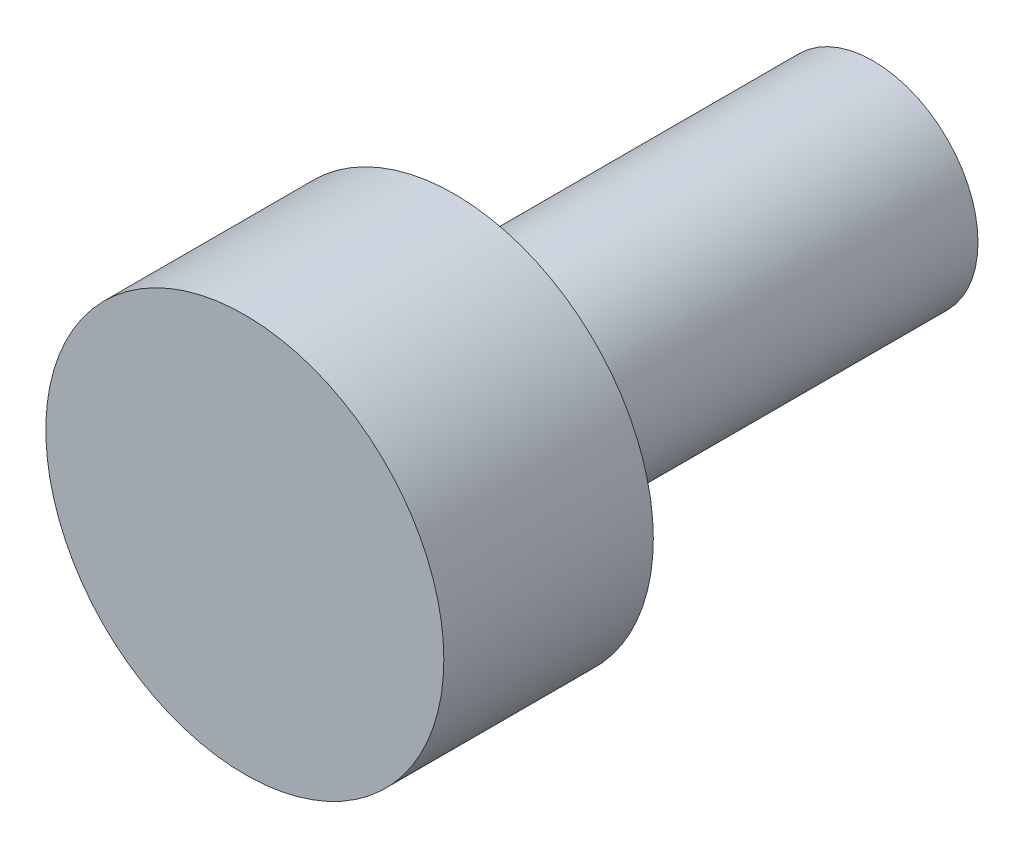
ISO-10303-21;
HEADER;
FILE_DESCRIPTION(('STEP AP214'),'2;1');
FILE_NAME('part.step','',(''),(''),'','','');
FILE_SCHEMA(('AUTOMOTIVE_DESIGN { 1 0 10303 214 1 1 1 1 }'));
ENDSEC;
DATA;
#1=APPLICATION_CONTEXT('core data for automotive mechanical design processes');
#2=APPLICATION_PROTOCOL_DEFINITION('international standard','automotive_design',2000,#1);
#3=PRODUCT_CONTEXT('',#1,'mechanical');
#4=PRODUCT('Part','Part','',(#3));
#5=PRODUCT_RELATED_PRODUCT_CATEGORY('part','',(#4));
#6=PRODUCT_DEFINITION_FORMATION('','',#4);
#7=PRODUCT_DEFINITION_CONTEXT('part definition',#1,'design');
#8=PRODUCT_DEFINITION('design','',#6,#7);
#9=PRODUCT_DEFINITION_SHAPE('','',#8);
#10=(LENGTH_UNIT() NAMED_UNIT(*) SI_UNIT(.MILLI.,.METRE.));
#11=(NAMED_UNIT(*) PLANE_ANGLE_UNIT() SI_UNIT($,.RADIAN.));
#12=(NAMED_UNIT(*) SI_UNIT($,.STERADIAN.) SOLID_ANGLE_UNIT());
#13=UNCERTAINTY_MEASURE_WITH_UNIT(LENGTH_MEASURE(1.E-05),#10,'distance_accuracy_value','');
#14=(GEOMETRIC_REPRESENTATION_CONTEXT(3) GLOBAL_UNCERTAINTY_ASSIGNED_CONTEXT((#13)) GLOBAL_UNIT_ASSIGNED_CONTEXT((#10,
#11,#12)) REPRESENTATION_CONTEXT('',''));
#15=CARTESIAN_POINT('',(0.,0.,0.));
#16=DIRECTION('',(0.,0.,1.));
#17=DIRECTION('',(1.,0.,0.));
#18=AXIS2_PLACEMENT_3D('',#15,#16,#17);
#19=CARTESIAN_POINT('',(0.,0.,0.));
#20=DIRECTION('',(0.,0.,-1.));
#21=DIRECTION('',(-1.,0.,0.));
#22=AXIS2_PLACEMENT_3D('',#19,#20,#21);
#23=CYLINDRICAL_SURFACE('',#22,1.);
#24=CARTESIAN_POINT('',(0.,0.,0.));
#25=DIRECTION('',(0.,0.,1.));
#26=DIRECTION('',(1.,0.,0.));
#27=AXIS2_PLACEMENT_3D('',#24,#25,#26);
#28=CIRCLE('',#27,1.);
#29=CARTESIAN_POINT('',(1.,0.,0.));
#30=VERTEX_POINT('',#29);
#31=EDGE_CURVE('E10',#30,#30,#28,.T.);
#32=ORIENTED_EDGE('',*,*,#31,.F.);
#33=EDGE_LOOP('',(#32));
#34=FACE_BOUND('',#33,.T.);
#35=CARTESIAN_POINT('',(0.,0.,-4.));
#36=DIRECTION('',(0.,0.,1.));
#37=DIRECTION('',(1.,0.,0.));
#38=AXIS2_PLACEMENT_3D('',#35,#36,#37);
#39=CIRCLE('',#38,1.);
#40=CARTESIAN_POINT('',(1.,0.,-4.));
#41=VERTEX_POINT('',#40);
#42=EDGE_CURVE('E37',#41,#41,#39,.T.);
#43=ORIENTED_EDGE('',*,*,#42,.T.);
#44=EDGE_LOOP('',(#43));
#45=FACE_BOUND('',#44,.T.);
#46=ADVANCED_FACE('F40',(#34,#45),#23,.T.);
#47=CARTESIAN_POINT('',(0.,0.,-4.));
#48=DIRECTION('',(0.,0.,1.));
#49=DIRECTION('',(1.,0.,0.));
#50=AXIS2_PLACEMENT_3D('',#47,#48,#49);
#51=PLANE('',#50);
#52=ORIENTED_EDGE('',*,*,#42,.F.);
#53=EDGE_LOOP('',(#52));
#54=FACE_BOUND('',#53,.T.);
#55=ADVANCED_FACE('F58',(#54),#51,.F.);
#56=CARTESIAN_POINT('',(0.,0.,2.));
#57=DIRECTION('',(0.,0.,-1.));
#58=DIRECTION('',(-1.,0.,0.));
#59=AXIS2_PLACEMENT_3D('',#56,#57,#58);
#60=CYLINDRICAL_SURFACE('',#59,1.9);
#61=CARTESIAN_POINT('',(0.,0.,2.));
#62=DIRECTION('',(0.,0.,1.));
#63=DIRECTION('',(1.,0.,0.));
#64=AXIS2_PLACEMENT_3D('',#61,#62,#63);
#65=CIRCLE('',#64,1.9);
#66=CARTESIAN_POINT('',(1.9,0.,2.));
#67=VERTEX_POINT('',#66);
#68=EDGE_CURVE('E50',#67,#67,#65,.T.);
#69=ORIENTED_EDGE('',*,*,#68,.F.);
#70=EDGE_LOOP('',(#69));
#71=FACE_BOUND('',#70,.T.);
#72=CARTESIAN_POINT('',(0.,0.,0.));
#73=DIRECTION('',(0.,0.,1.));
#74=DIRECTION('',(1.,0.,0.));
#75=AXIS2_PLACEMENT_3D('',#72,#73,#74);
#76=CIRCLE('',#75,1.9);
#77=CARTESIAN_POINT('',(1.9,0.,0.));
#78=VERTEX_POINT('',#77);
#79=EDGE_CURVE('E47',#78,#78,#76,.T.);
#80=ORIENTED_EDGE('',*,*,#79,.T.);
#81=EDGE_LOOP('',(#80));
#82=FACE_BOUND('',#81,.T.);
#83=ADVANCED_FACE('F60',(#71,#82),#60,.T.);
#84=CARTESIAN_POINT('',(0.,0.,2.));
#85=DIRECTION('',(0.,0.,1.));
#86=DIRECTION('',(1.,0.,0.));
#87=AXIS2_PLACEMENT_3D('',#84,#85,#86);
#88=PLANE('',#87);
#89=ORIENTED_EDGE('',*,*,#68,.T.);
#90=EDGE_LOOP('',(#89));
#91=FACE_BOUND('',#90,.T.);
#92=ADVANCED_FACE('F54',(#91),#88,.T.);
#93=CARTESIAN_POINT('',(0.,0.,0.));
#94=DIRECTION('',(0.,0.,1.));
#95=DIRECTION('',(1.,0.,0.));
#96=AXIS2_PLACEMENT_3D('',#93,#94,#95);
#97=PLANE('',#96);
#98=ORIENTED_EDGE('',*,*,#31,.T.);
#99=EDGE_LOOP('',(#98));
#100=FACE_BOUND('',#99,.T.);
#101=ORIENTED_EDGE('',*,*,#79,.F.);
#102=EDGE_LOOP('',(#101));
#103=FACE_BOUND('',#102,.T.);
#104=ADVANCED_FACE('F63',(#100,#103),#97,.F.);
#105=CLOSED_SHELL('',(#46,#55,#83,#92,#104));
#106=MANIFOLD_SOLID_BREP('B2',#105);
#107=ADVANCED_BREP_SHAPE_REPRESENTATION('',(#18,#106),#14);
#108=SHAPE_DEFINITION_REPRESENTATION(#9,#107);
ENDSEC;
END-ISO-10303-21;
